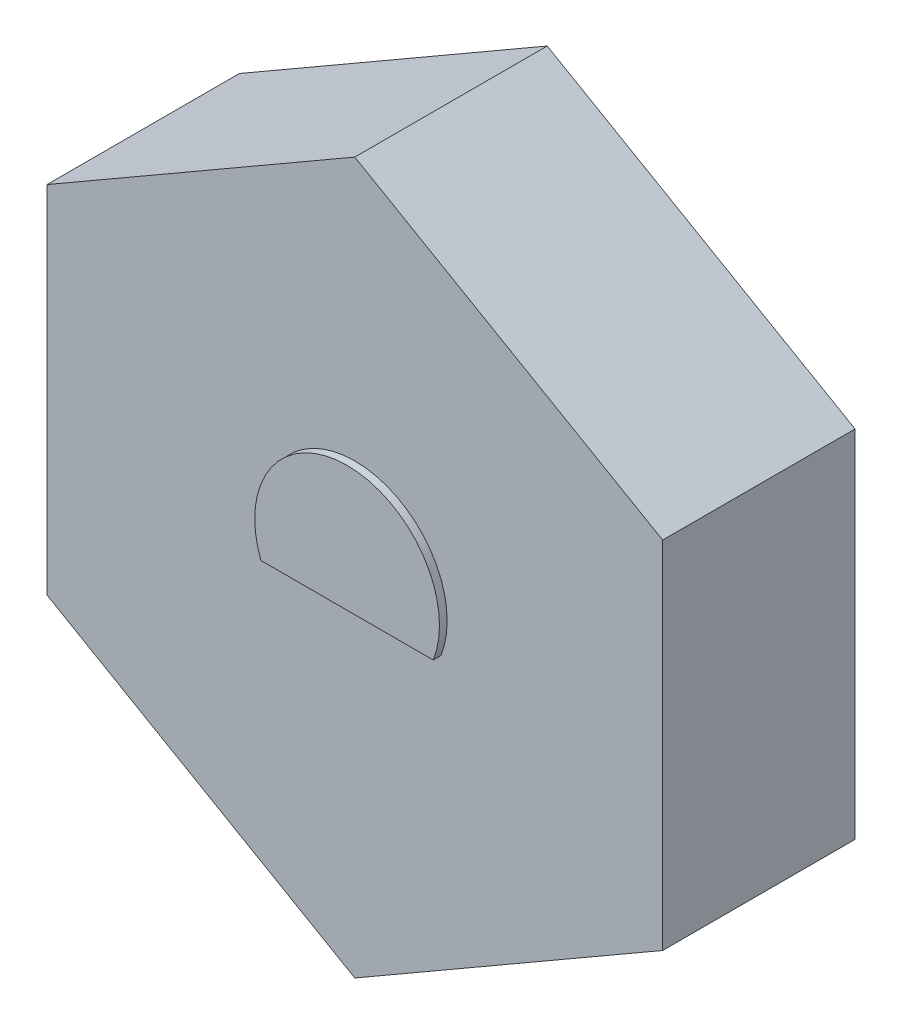
ISO-10303-21;
HEADER;
FILE_DESCRIPTION(('STEP AP214'),'2;1');
FILE_NAME('part.step','',(''),(''),'','','');
FILE_SCHEMA(('AUTOMOTIVE_DESIGN { 1 0 10303 214 1 1 1 1 }'));
ENDSEC;
DATA;
#1=APPLICATION_CONTEXT('core data for automotive mechanical design processes');
#2=APPLICATION_PROTOCOL_DEFINITION('international standard','automotive_design',2000,#1);
#3=PRODUCT_CONTEXT('',#1,'mechanical');
#4=PRODUCT('Part','Part','',(#3));
#5=PRODUCT_RELATED_PRODUCT_CATEGORY('part','',(#4));
#6=PRODUCT_DEFINITION_FORMATION('','',#4);
#7=PRODUCT_DEFINITION_CONTEXT('part definition',#1,'design');
#8=PRODUCT_DEFINITION('design','',#6,#7);
#9=PRODUCT_DEFINITION_SHAPE('','',#8);
#10=(LENGTH_UNIT() NAMED_UNIT(*) SI_UNIT(.MILLI.,.METRE.));
#11=(NAMED_UNIT(*) PLANE_ANGLE_UNIT() SI_UNIT($,.RADIAN.));
#12=(NAMED_UNIT(*) SI_UNIT($,.STERADIAN.) SOLID_ANGLE_UNIT());
#13=UNCERTAINTY_MEASURE_WITH_UNIT(LENGTH_MEASURE(1.E-05),#10,'distance_accuracy_value','');
#14=(GEOMETRIC_REPRESENTATION_CONTEXT(3) GLOBAL_UNCERTAINTY_ASSIGNED_CONTEXT((#13)) GLOBAL_UNIT_ASSIGNED_CONTEXT((#10,
#11,#12)) REPRESENTATION_CONTEXT('',''));
#15=CARTESIAN_POINT('',(0.,0.,0.));
#16=DIRECTION('',(0.,0.,1.));
#17=DIRECTION('',(1.,0.,0.));
#18=AXIS2_PLACEMENT_3D('',#15,#16,#17);
#19=CARTESIAN_POINT('',(-28.51,-1.0770329614269,-97.));
#20=DIRECTION('',(0.,0.,-1.));
#21=DIRECTION('',(0.,1.,0.));
#22=AXIS2_PLACEMENT_3D('',#19,#20,#21);
#23=PLANE('',#22);
#24=DIRECTION('',(1.,0.,0.));
#25=VECTOR('',#24,1.);
#26=CARTESIAN_POINT('',(2.8,-1.0770329614269,-97.));
#27=LINE('',#26,#25);
#28=CARTESIAN_POINT('',(-2.8,-1.0770329614269,-97.));
#29=VERTEX_POINT('',#28);
#30=CARTESIAN_POINT('',(2.8,-1.0770329614269,-97.));
#31=VERTEX_POINT('',#30);
#32=EDGE_CURVE('E11',#29,#31,#27,.T.);
#33=ORIENTED_EDGE('',*,*,#32,.T.);
#34=CARTESIAN_POINT('',(0.,0.,-97.));
#35=DIRECTION('',(0.,0.,1.));
#36=DIRECTION('',(1.,0.,0.));
#37=AXIS2_PLACEMENT_3D('',#34,#35,#36);
#38=CIRCLE('',#37,3.);
#39=EDGE_CURVE('E49',#31,#29,#38,.T.);
#40=ORIENTED_EDGE('',*,*,#39,.T.);
#41=EDGE_LOOP('',(#33,#40));
#42=FACE_BOUND('',#41,.T.);
#43=ADVANCED_FACE('F41',(#42),#23,.F.);
#44=CARTESIAN_POINT('',(0.,3.,-105.));
#45=DIRECTION('',(0.,0.,1.));
#46=DIRECTION('',(1.,0.,0.));
#47=AXIS2_PLACEMENT_3D('',#44,#45,#46);
#48=PLANE('',#47);
#49=CARTESIAN_POINT('',(0.,0.,-105.));
#50=DIRECTION('',(0.,0.,1.));
#51=DIRECTION('',(1.,0.,0.));
#52=AXIS2_PLACEMENT_3D('',#49,#50,#51);
#53=CIRCLE('',#52,3.);
#54=CARTESIAN_POINT('',(2.8,-1.0770329614269,-105.));
#55=VERTEX_POINT('',#54);
#56=CARTESIAN_POINT('',(-2.8,-1.0770329614269,-105.));
#57=VERTEX_POINT('',#56);
#58=EDGE_CURVE('E188',#55,#57,#53,.T.);
#59=ORIENTED_EDGE('',*,*,#58,.F.);
#60=DIRECTION('',(1.,0.,0.));
#61=VECTOR('',#60,1.);
#62=CARTESIAN_POINT('',(2.8,-1.0770329614269,-105.));
#63=LINE('',#62,#61);
#64=EDGE_CURVE('E181',#57,#55,#63,.T.);
#65=ORIENTED_EDGE('',*,*,#64,.F.);
#66=EDGE_LOOP('',(#59,#65));
#67=FACE_BOUND('',#66,.T.);
#68=ADVANCED_FACE('F220',(#67),#48,.F.);
#69=CARTESIAN_POINT('',(2.8,-1.0770329614269,-97.));
#70=DIRECTION('',(0.,1.,0.));
#71=DIRECTION('',(0.,0.,1.));
#72=AXIS2_PLACEMENT_3D('',#69,#70,#71);
#73=PLANE('',#72);
#74=DIRECTION('',(0.,0.,-1.));
#75=VECTOR('',#74,1.);
#76=CARTESIAN_POINT('',(2.8,-1.0770329614269,-97.));
#77=LINE('',#76,#75);
#78=CARTESIAN_POINT('',(2.8,-1.0770329614269,-103.5));
#79=VERTEX_POINT('',#78);
#80=EDGE_CURVE('E189',#79,#55,#77,.T.);
#81=ORIENTED_EDGE('',*,*,#80,.F.);
#82=DIRECTION('',(-1.,0.,0.));
#83=VECTOR('',#82,1.);
#84=CARTESIAN_POINT('',(2.8,-1.0770329614269,-103.5));
#85=LINE('',#84,#83);
#86=CARTESIAN_POINT('',(-2.8,-1.0770329614269,-103.5));
#87=VERTEX_POINT('',#86);
#88=EDGE_CURVE('E194',#79,#87,#85,.T.);
#89=ORIENTED_EDGE('',*,*,#88,.T.);
#90=DIRECTION('',(0.,0.,-1.));
#91=VECTOR('',#90,1.);
#92=CARTESIAN_POINT('',(-2.8,-1.0770329614269,-97.));
#93=LINE('',#92,#91);
#94=EDGE_CURVE('E185',#87,#57,#93,.T.);
#95=ORIENTED_EDGE('',*,*,#94,.T.);
#96=ORIENTED_EDGE('',*,*,#64,.T.);
#97=EDGE_LOOP('',(#81,#89,#95,#96));
#98=FACE_BOUND('',#97,.T.);
#99=ADVANCED_FACE('F217',(#98),#73,.F.);
#100=CARTESIAN_POINT('',(0.,0.,94.0086439358806));
#101=DIRECTION('',(0.,0.,1.));
#102=DIRECTION('',(1.,0.,0.));
#103=AXIS2_PLACEMENT_3D('',#100,#101,#102);
#104=CYLINDRICAL_SURFACE('',#103,3.);
#105=ORIENTED_EDGE('',*,*,#94,.F.);
#106=CARTESIAN_POINT('',(0.,0.,-103.5));
#107=DIRECTION('',(0.,0.,-1.));
#108=DIRECTION('',(-1.,0.,0.));
#109=AXIS2_PLACEMENT_3D('',#106,#107,#108);
#110=CIRCLE('',#109,3.);
#111=EDGE_CURVE('E169',#87,#79,#110,.T.);
#112=ORIENTED_EDGE('',*,*,#111,.T.);
#113=ORIENTED_EDGE('',*,*,#80,.T.);
#114=ORIENTED_EDGE('',*,*,#58,.T.);
#115=EDGE_LOOP('',(#105,#112,#113,#114));
#116=FACE_BOUND('',#115,.T.);
#117=ADVANCED_FACE('F206',(#116),#104,.T.);
#118=CARTESIAN_POINT('',(0.,0.,-103.5));
#119=DIRECTION('',(0.,0.,-1.));
#120=DIRECTION('',(-1.,0.,0.));
#121=AXIS2_PLACEMENT_3D('',#118,#119,#120);
#122=PLANE('',#121);
#123=DIRECTION('',(0.866025403784439,0.5,0.));
#124=VECTOR('',#123,1.);
#125=CARTESIAN_POINT('',(-10.,5.77350269189626,-103.5));
#126=LINE('',#125,#124);
#127=CARTESIAN_POINT('',(-10.,5.77350269189626,-103.5));
#128=VERTEX_POINT('',#127);
#129=CARTESIAN_POINT('',(0.,11.5470053837925,-103.5));
#130=VERTEX_POINT('',#129);
#131=EDGE_CURVE('E157',#128,#130,#126,.T.);
#132=ORIENTED_EDGE('',*,*,#131,.T.);
#133=DIRECTION('',(0.866025403784438,-0.5,0.));
#134=VECTOR('',#133,1.);
#135=CARTESIAN_POINT('',(0.,11.5470053837925,-103.5));
#136=LINE('',#135,#134);
#137=CARTESIAN_POINT('',(10.,5.77350269189626,-103.5));
#138=VERTEX_POINT('',#137);
#139=EDGE_CURVE('E121',#130,#138,#136,.T.);
#140=ORIENTED_EDGE('',*,*,#139,.T.);
#141=DIRECTION('',(0.,-1.,0.));
#142=VECTOR('',#141,1.);
#143=CARTESIAN_POINT('',(10.,5.77350269189626,-103.5));
#144=LINE('',#143,#142);
#145=CARTESIAN_POINT('',(9.99999999999999,-5.77350269189626,-103.5));
#146=VERTEX_POINT('',#145);
#147=EDGE_CURVE('E160',#138,#146,#144,.T.);
#148=ORIENTED_EDGE('',*,*,#147,.T.);
#149=DIRECTION('',(-0.866025403784439,-0.5,0.));
#150=VECTOR('',#149,1.);
#151=CARTESIAN_POINT('',(9.99999999999999,-5.77350269189626,-103.5));
#152=LINE('',#151,#150);
#153=CARTESIAN_POINT('',(0.,-11.5470053837925,-103.5));
#154=VERTEX_POINT('',#153);
#155=EDGE_CURVE('E163',#146,#154,#152,.T.);
#156=ORIENTED_EDGE('',*,*,#155,.T.);
#157=DIRECTION('',(-0.866025403784439,0.5,0.));
#158=VECTOR('',#157,1.);
#159=CARTESIAN_POINT('',(0.,-11.5470053837925,-103.5));
#160=LINE('',#159,#158);
#161=CARTESIAN_POINT('',(-10.,-5.77350269189626,-103.5));
#162=VERTEX_POINT('',#161);
#163=EDGE_CURVE('E146',#154,#162,#160,.T.);
#164=ORIENTED_EDGE('',*,*,#163,.T.);
#165=DIRECTION('',(0.,1.,0.));
#166=VECTOR('',#165,1.);
#167=CARTESIAN_POINT('',(-10.,-5.77350269189626,-103.5));
#168=LINE('',#167,#166);
#169=EDGE_CURVE('E143',#162,#128,#168,.T.);
#170=ORIENTED_EDGE('',*,*,#169,.T.);
#171=EDGE_LOOP('',(#132,#140,#148,#156,#164,#170));
#172=FACE_BOUND('',#171,.T.);
#173=ORIENTED_EDGE('',*,*,#111,.F.);
#174=ORIENTED_EDGE('',*,*,#88,.F.);
#175=EDGE_LOOP('',(#173,#174));
#176=FACE_BOUND('',#175,.T.);
#177=ADVANCED_FACE('F216',(#172,#176),#122,.T.);
#178=CARTESIAN_POINT('',(0.,11.5470053837925,-97.25));
#179=DIRECTION('',(0.5,0.866025403784438,0.));
#180=DIRECTION('',(-0.866025403784438,0.5,0.));
#181=AXIS2_PLACEMENT_3D('',#178,#179,#180);
#182=PLANE('',#181);
#183=ORIENTED_EDGE('',*,*,#139,.F.);
#184=DIRECTION('',(0.,0.,-1.));
#185=VECTOR('',#184,1.);
#186=CARTESIAN_POINT('',(0.,11.5470053837925,-97.25));
#187=LINE('',#186,#185);
#188=CARTESIAN_POINT('',(0.,11.5470053837925,-97.25));
#189=VERTEX_POINT('',#188);
#190=EDGE_CURVE('E116',#189,#130,#187,.T.);
#191=ORIENTED_EDGE('',*,*,#190,.F.);
#192=DIRECTION('',(0.866025403784438,-0.5,0.));
#193=VECTOR('',#192,1.);
#194=CARTESIAN_POINT('',(0.,11.5470053837925,-97.25));
#195=LINE('',#194,#193);
#196=CARTESIAN_POINT('',(10.,5.77350269189626,-97.25));
#197=VERTEX_POINT('',#196);
#198=EDGE_CURVE('E119',#189,#197,#195,.T.);
#199=ORIENTED_EDGE('',*,*,#198,.T.);
#200=DIRECTION('',(0.,0.,-1.));
#201=VECTOR('',#200,1.);
#202=CARTESIAN_POINT('',(10.,5.77350269189626,-97.25));
#203=LINE('',#202,#201);
#204=EDGE_CURVE('E126',#197,#138,#203,.T.);
#205=ORIENTED_EDGE('',*,*,#204,.T.);
#206=EDGE_LOOP('',(#183,#191,#199,#205));
#207=FACE_BOUND('',#206,.T.);
#208=ADVANCED_FACE('F118',(#207),#182,.T.);
#209=CARTESIAN_POINT('',(10.,5.77350269189626,-97.25));
#210=DIRECTION('',(1.,0.,0.));
#211=DIRECTION('',(0.,1.,0.));
#212=AXIS2_PLACEMENT_3D('',#209,#210,#211);
#213=PLANE('',#212);
#214=ORIENTED_EDGE('',*,*,#147,.F.);
#215=ORIENTED_EDGE('',*,*,#204,.F.);
#216=DIRECTION('',(0.,-1.,0.));
#217=VECTOR('',#216,1.);
#218=CARTESIAN_POINT('',(10.,5.77350269189626,-97.25));
#219=LINE('',#218,#217);
#220=CARTESIAN_POINT('',(9.99999999999999,-5.77350269189626,-97.25));
#221=VERTEX_POINT('',#220);
#222=EDGE_CURVE('E139',#197,#221,#219,.T.);
#223=ORIENTED_EDGE('',*,*,#222,.T.);
#224=DIRECTION('',(0.,0.,-1.));
#225=VECTOR('',#224,1.);
#226=CARTESIAN_POINT('',(9.99999999999999,-5.77350269189626,-97.25));
#227=LINE('',#226,#225);
#228=EDGE_CURVE('E174',#221,#146,#227,.T.);
#229=ORIENTED_EDGE('',*,*,#228,.T.);
#230=EDGE_LOOP('',(#214,#215,#223,#229));
#231=FACE_BOUND('',#230,.T.);
#232=ADVANCED_FACE('F233',(#231),#213,.T.);
#233=CARTESIAN_POINT('',(9.99999999999999,-5.77350269189626,-97.25));
#234=DIRECTION('',(0.5,-0.866025403784439,0.));
#235=DIRECTION('',(0.866025403784439,0.5,0.));
#236=AXIS2_PLACEMENT_3D('',#233,#234,#235);
#237=PLANE('',#236);
#238=ORIENTED_EDGE('',*,*,#155,.F.);
#239=ORIENTED_EDGE('',*,*,#228,.F.);
#240=DIRECTION('',(-0.866025403784439,-0.5,0.));
#241=VECTOR('',#240,1.);
#242=CARTESIAN_POINT('',(9.99999999999999,-5.77350269189626,-97.25));
#243=LINE('',#242,#241);
#244=CARTESIAN_POINT('',(0.,-11.5470053837925,-97.25));
#245=VERTEX_POINT('',#244);
#246=EDGE_CURVE('E150',#221,#245,#243,.T.);
#247=ORIENTED_EDGE('',*,*,#246,.T.);
#248=DIRECTION('',(0.,0.,-1.));
#249=VECTOR('',#248,1.);
#250=CARTESIAN_POINT('',(0.,-11.5470053837925,-97.25));
#251=LINE('',#250,#249);
#252=EDGE_CURVE('E172',#245,#154,#251,.T.);
#253=ORIENTED_EDGE('',*,*,#252,.T.);
#254=EDGE_LOOP('',(#238,#239,#247,#253));
#255=FACE_BOUND('',#254,.T.);
#256=ADVANCED_FACE('F236',(#255),#237,.T.);
#257=CARTESIAN_POINT('',(0.,-11.5470053837925,-97.25));
#258=DIRECTION('',(-0.5,-0.866025403784439,0.));
#259=DIRECTION('',(0.866025403784439,-0.5,0.));
#260=AXIS2_PLACEMENT_3D('',#257,#258,#259);
#261=PLANE('',#260);
#262=ORIENTED_EDGE('',*,*,#163,.F.);
#263=ORIENTED_EDGE('',*,*,#252,.F.);
#264=DIRECTION('',(-0.866025403784439,0.5,0.));
#265=VECTOR('',#264,1.);
#266=CARTESIAN_POINT('',(0.,-11.5470053837925,-97.25));
#267=LINE('',#266,#265);
#268=CARTESIAN_POINT('',(-10.,-5.77350269189626,-97.25));
#269=VERTEX_POINT('',#268);
#270=EDGE_CURVE('E153',#245,#269,#267,.T.);
#271=ORIENTED_EDGE('',*,*,#270,.T.);
#272=DIRECTION('',(0.,0.,-1.));
#273=VECTOR('',#272,1.);
#274=CARTESIAN_POINT('',(-10.,-5.77350269189626,-97.25));
#275=LINE('',#274,#273);
#276=EDGE_CURVE('E170',#269,#162,#275,.T.);
#277=ORIENTED_EDGE('',*,*,#276,.T.);
#278=EDGE_LOOP('',(#262,#263,#271,#277));
#279=FACE_BOUND('',#278,.T.);
#280=ADVANCED_FACE('F240',(#279),#261,.T.);
#281=CARTESIAN_POINT('',(-10.,-5.77350269189626,-97.25));
#282=DIRECTION('',(-1.,0.,0.));
#283=DIRECTION('',(0.,-1.,0.));
#284=AXIS2_PLACEMENT_3D('',#281,#282,#283);
#285=PLANE('',#284);
#286=ORIENTED_EDGE('',*,*,#169,.F.);
#287=ORIENTED_EDGE('',*,*,#276,.F.);
#288=DIRECTION('',(0.,1.,0.));
#289=VECTOR('',#288,1.);
#290=CARTESIAN_POINT('',(-10.,-5.77350269189626,-97.25));
#291=LINE('',#290,#289);
#292=CARTESIAN_POINT('',(-10.,5.77350269189626,-97.25));
#293=VERTEX_POINT('',#292);
#294=EDGE_CURVE('E127',#269,#293,#291,.T.);
#295=ORIENTED_EDGE('',*,*,#294,.T.);
#296=DIRECTION('',(0.,0.,-1.));
#297=VECTOR('',#296,1.);
#298=CARTESIAN_POINT('',(-10.,5.77350269189626,-97.25));
#299=LINE('',#298,#297);
#300=EDGE_CURVE('E142',#293,#128,#299,.T.);
#301=ORIENTED_EDGE('',*,*,#300,.T.);
#302=EDGE_LOOP('',(#286,#287,#295,#301));
#303=FACE_BOUND('',#302,.T.);
#304=ADVANCED_FACE('F212',(#303),#285,.T.);
#305=CARTESIAN_POINT('',(-10.,5.77350269189626,-97.25));
#306=DIRECTION('',(-0.5,0.866025403784439,0.));
#307=DIRECTION('',(-0.866025403784439,-0.5,0.));
#308=AXIS2_PLACEMENT_3D('',#305,#306,#307);
#309=PLANE('',#308);
#310=ORIENTED_EDGE('',*,*,#131,.F.);
#311=ORIENTED_EDGE('',*,*,#300,.F.);
#312=DIRECTION('',(0.866025403784439,0.5,0.));
#313=VECTOR('',#312,1.);
#314=CARTESIAN_POINT('',(-10.,5.77350269189626,-97.25));
#315=LINE('',#314,#313);
#316=EDGE_CURVE('E135',#293,#189,#315,.T.);
#317=ORIENTED_EDGE('',*,*,#316,.T.);
#318=ORIENTED_EDGE('',*,*,#190,.T.);
#319=EDGE_LOOP('',(#310,#311,#317,#318));
#320=FACE_BOUND('',#319,.T.);
#321=ADVANCED_FACE('F141',(#320),#309,.T.);
#322=CARTESIAN_POINT('',(0.,0.,-97.25));
#323=DIRECTION('',(0.,0.,-1.));
#324=DIRECTION('',(-1.,0.,0.));
#325=AXIS2_PLACEMENT_3D('',#322,#323,#324);
#326=CIRCLE('',#325,3.);
#327=CARTESIAN_POINT('',(-2.8,-1.0770329614269,-97.25));
#328=VERTEX_POINT('',#327);
#329=CARTESIAN_POINT('',(2.8,-1.0770329614269,-97.25));
#330=VERTEX_POINT('',#329);
#331=EDGE_CURVE('E179',#328,#330,#326,.T.);
#332=ORIENTED_EDGE('',*,*,#331,.F.);
#333=EDGE_CURVE('E190',#29,#328,#93,.T.);
#334=ORIENTED_EDGE('',*,*,#333,.F.);
#335=ORIENTED_EDGE('',*,*,#39,.F.);
#336=EDGE_CURVE('E186',#31,#330,#77,.T.);
#337=ORIENTED_EDGE('',*,*,#336,.T.);
#338=EDGE_LOOP('',(#332,#334,#335,#337));
#339=FACE_BOUND('',#338,.T.);
#340=ADVANCED_FACE('F204',(#339),#104,.T.);
#341=CARTESIAN_POINT('',(0.,0.,-97.25));
#342=DIRECTION('',(0.,0.,-1.));
#343=DIRECTION('',(-1.,0.,0.));
#344=AXIS2_PLACEMENT_3D('',#341,#342,#343);
#345=PLANE('',#344);
#346=ORIENTED_EDGE('',*,*,#316,.F.);
#347=ORIENTED_EDGE('',*,*,#294,.F.);
#348=ORIENTED_EDGE('',*,*,#270,.F.);
#349=ORIENTED_EDGE('',*,*,#246,.F.);
#350=ORIENTED_EDGE('',*,*,#222,.F.);
#351=ORIENTED_EDGE('',*,*,#198,.F.);
#352=EDGE_LOOP('',(#346,#347,#348,#349,#350,#351));
#353=FACE_BOUND('',#352,.T.);
#354=DIRECTION('',(-1.,0.,0.));
#355=VECTOR('',#354,1.);
#356=CARTESIAN_POINT('',(2.8,-1.0770329614269,-97.25));
#357=LINE('',#356,#355);
#358=EDGE_CURVE('E44',#330,#328,#357,.T.);
#359=ORIENTED_EDGE('',*,*,#358,.T.);
#360=ORIENTED_EDGE('',*,*,#331,.T.);
#361=EDGE_LOOP('',(#359,#360));
#362=FACE_BOUND('',#361,.T.);
#363=ADVANCED_FACE('F132',(#353,#362),#345,.F.);
#364=ORIENTED_EDGE('',*,*,#358,.F.);
#365=ORIENTED_EDGE('',*,*,#336,.F.);
#366=ORIENTED_EDGE('',*,*,#32,.F.);
#367=ORIENTED_EDGE('',*,*,#333,.T.);
#368=EDGE_LOOP('',(#364,#365,#366,#367));
#369=FACE_BOUND('',#368,.T.);
#370=ADVANCED_FACE('F203',(#369),#73,.F.);
#371=CLOSED_SHELL('',(#43,#68,#99,#117,#177,#208,#232,#256,#280,#304,#321,#340,#363,#370));
#372=MANIFOLD_SOLID_BREP('B2',#371);
#373=ADVANCED_BREP_SHAPE_REPRESENTATION('',(#18,#372),#14);
#374=SHAPE_DEFINITION_REPRESENTATION(#9,#373);
ENDSEC;
END-ISO-10303-21;
